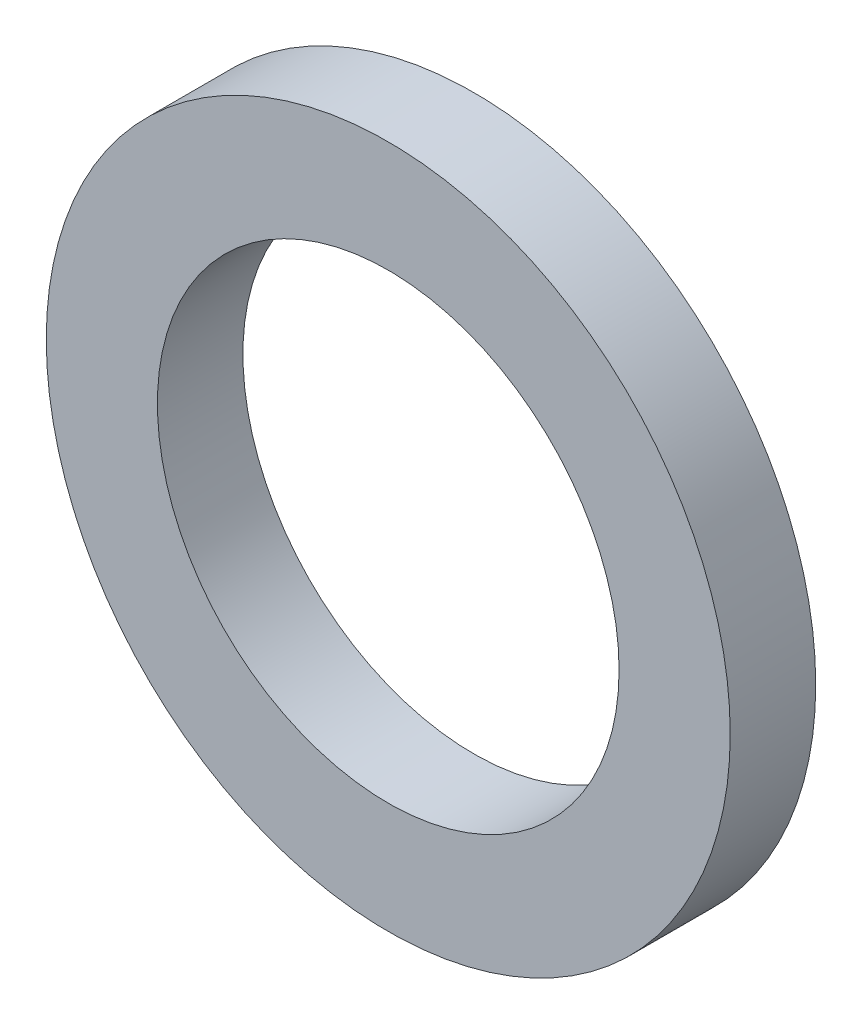
ISO-10303-21;
HEADER;
FILE_DESCRIPTION(('STEP AP214'),'2;1');
FILE_NAME('part.step','',(''),(''),'','','');
FILE_SCHEMA(('AUTOMOTIVE_DESIGN { 1 0 10303 214 1 1 1 1 }'));
ENDSEC;
DATA;
#1=APPLICATION_CONTEXT('core data for automotive mechanical design processes');
#2=APPLICATION_PROTOCOL_DEFINITION('international standard','automotive_design',2000,#1);
#3=PRODUCT_CONTEXT('',#1,'mechanical');
#4=PRODUCT('Part','Part','',(#3));
#5=PRODUCT_RELATED_PRODUCT_CATEGORY('part','',(#4));
#6=PRODUCT_DEFINITION_FORMATION('','',#4);
#7=PRODUCT_DEFINITION_CONTEXT('part definition',#1,'design');
#8=PRODUCT_DEFINITION('design','',#6,#7);
#9=PRODUCT_DEFINITION_SHAPE('','',#8);
#10=(LENGTH_UNIT() NAMED_UNIT(*) SI_UNIT(.MILLI.,.METRE.));
#11=(NAMED_UNIT(*) PLANE_ANGLE_UNIT() SI_UNIT($,.RADIAN.));
#12=(NAMED_UNIT(*) SI_UNIT($,.STERADIAN.) SOLID_ANGLE_UNIT());
#13=UNCERTAINTY_MEASURE_WITH_UNIT(LENGTH_MEASURE(1.E-05),#10,'distance_accuracy_value','');
#14=(GEOMETRIC_REPRESENTATION_CONTEXT(3) GLOBAL_UNCERTAINTY_ASSIGNED_CONTEXT((#13)) GLOBAL_UNIT_ASSIGNED_CONTEXT((#10,
#11,#12)) REPRESENTATION_CONTEXT('',''));
#15=CARTESIAN_POINT('',(0.,0.,0.));
#16=DIRECTION('',(0.,0.,1.));
#17=DIRECTION('',(1.,0.,0.));
#18=AXIS2_PLACEMENT_3D('',#15,#16,#17);
#19=CARTESIAN_POINT('',(0.,0.,1.5));
#20=DIRECTION('',(0.,0.,1.));
#21=DIRECTION('',(1.,0.,0.));
#22=AXIS2_PLACEMENT_3D('',#19,#20,#21);
#23=PLANE('',#22);
#24=CARTESIAN_POINT('',(0.,0.,1.5));
#25=DIRECTION('',(0.,0.,1.));
#26=DIRECTION('',(1.,0.,0.));
#27=AXIS2_PLACEMENT_3D('',#24,#25,#26);
#28=CIRCLE('',#27,6.);
#29=CARTESIAN_POINT('',(6.,0.,1.5));
#30=VERTEX_POINT('',#29);
#31=EDGE_CURVE('E10',#30,#30,#28,.T.);
#32=ORIENTED_EDGE('',*,*,#31,.T.);
#33=EDGE_LOOP('',(#32));
#34=FACE_BOUND('',#33,.T.);
#35=CARTESIAN_POINT('',(0.,0.,1.5));
#36=DIRECTION('',(0.,0.,1.));
#37=DIRECTION('',(1.,0.,0.));
#38=AXIS2_PLACEMENT_3D('',#35,#36,#37);
#39=CIRCLE('',#38,4.05);
#40=CARTESIAN_POINT('',(4.05,0.,1.5));
#41=VERTEX_POINT('',#40);
#42=EDGE_CURVE('E52',#41,#41,#39,.T.);
#43=ORIENTED_EDGE('',*,*,#42,.F.);
#44=EDGE_LOOP('',(#43));
#45=FACE_BOUND('',#44,.T.);
#46=ADVANCED_FACE('F41',(#34,#45),#23,.T.);
#47=CARTESIAN_POINT('',(0.,0.,0.));
#48=DIRECTION('',(0.,0.,1.));
#49=DIRECTION('',(1.,0.,0.));
#50=AXIS2_PLACEMENT_3D('',#47,#48,#49);
#51=PLANE('',#50);
#52=CARTESIAN_POINT('',(0.,0.,0.));
#53=DIRECTION('',(0.,0.,1.));
#54=DIRECTION('',(1.,0.,0.));
#55=AXIS2_PLACEMENT_3D('',#52,#53,#54);
#56=CIRCLE('',#55,6.);
#57=CARTESIAN_POINT('',(6.,0.,0.));
#58=VERTEX_POINT('',#57);
#59=EDGE_CURVE('E45',#58,#58,#56,.T.);
#60=ORIENTED_EDGE('',*,*,#59,.F.);
#61=EDGE_LOOP('',(#60));
#62=FACE_BOUND('',#61,.T.);
#63=CARTESIAN_POINT('',(0.,0.,0.));
#64=DIRECTION('',(0.,0.,1.));
#65=DIRECTION('',(1.,0.,0.));
#66=AXIS2_PLACEMENT_3D('',#63,#64,#65);
#67=CIRCLE('',#66,4.05);
#68=CARTESIAN_POINT('',(4.05,0.,0.));
#69=VERTEX_POINT('',#68);
#70=EDGE_CURVE('E54',#69,#69,#67,.T.);
#71=ORIENTED_EDGE('',*,*,#70,.T.);
#72=EDGE_LOOP('',(#71));
#73=FACE_BOUND('',#72,.T.);
#74=ADVANCED_FACE('F64',(#62,#73),#51,.F.);
#75=CARTESIAN_POINT('',(0.,0.,1.5));
#76=DIRECTION('',(0.,0.,-1.));
#77=DIRECTION('',(-1.,0.,0.));
#78=AXIS2_PLACEMENT_3D('',#75,#76,#77);
#79=CYLINDRICAL_SURFACE('',#78,6.);
#80=ORIENTED_EDGE('',*,*,#31,.F.);
#81=EDGE_LOOP('',(#80));
#82=FACE_BOUND('',#81,.T.);
#83=ORIENTED_EDGE('',*,*,#59,.T.);
#84=EDGE_LOOP('',(#83));
#85=FACE_BOUND('',#84,.T.);
#86=ADVANCED_FACE('F43',(#82,#85),#79,.T.);
#87=CARTESIAN_POINT('',(0.,0.,1.5));
#88=DIRECTION('',(0.,0.,-1.));
#89=DIRECTION('',(-1.,0.,0.));
#90=AXIS2_PLACEMENT_3D('',#87,#88,#89);
#91=CYLINDRICAL_SURFACE('',#90,4.05);
#92=ORIENTED_EDGE('',*,*,#42,.T.);
#93=EDGE_LOOP('',(#92));
#94=FACE_BOUND('',#93,.T.);
#95=ORIENTED_EDGE('',*,*,#70,.F.);
#96=EDGE_LOOP('',(#95));
#97=FACE_BOUND('',#96,.T.);
#98=ADVANCED_FACE('F60',(#94,#97),#91,.F.);
#99=CLOSED_SHELL('',(#46,#74,#86,#98));
#100=MANIFOLD_SOLID_BREP('B2',#99);
#101=ADVANCED_BREP_SHAPE_REPRESENTATION('',(#18,#100),#14);
#102=SHAPE_DEFINITION_REPRESENTATION(#9,#101);
ENDSEC;
END-ISO-10303-21;
